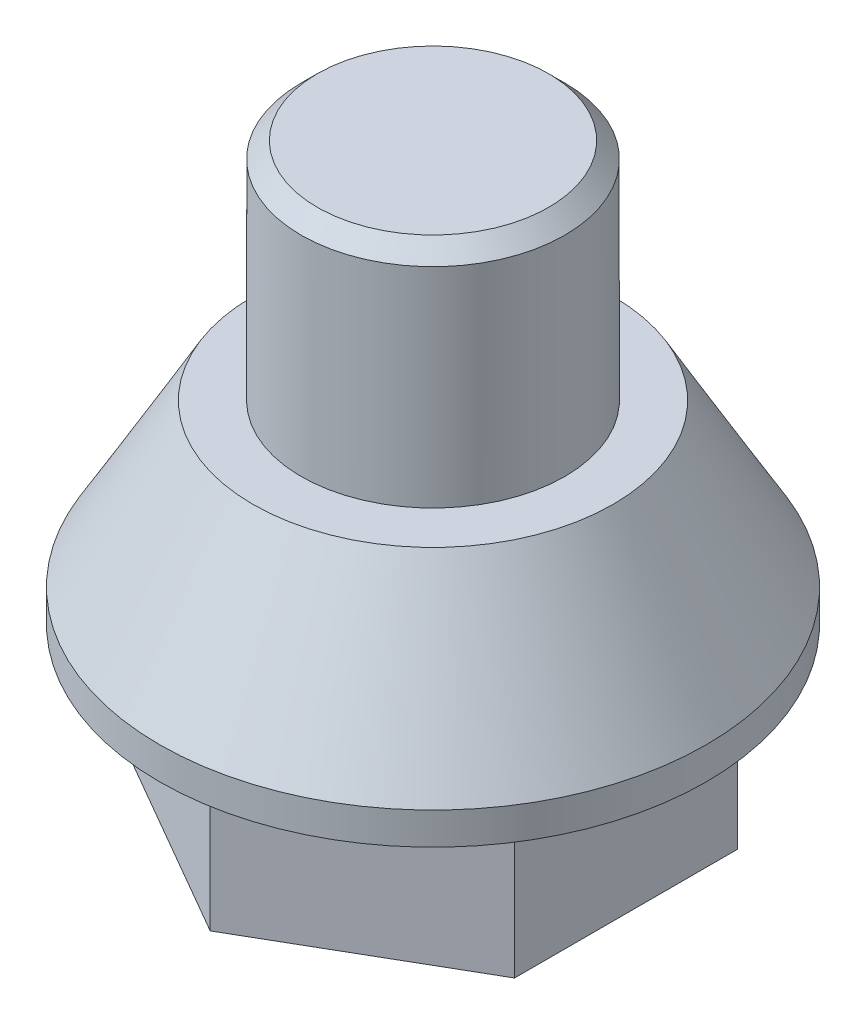
ISO-10303-21;
HEADER;
FILE_DESCRIPTION(('STEP AP214'),'2;1');
FILE_NAME('part.step','',(''),(''),'','','');
FILE_SCHEMA(('AUTOMOTIVE_DESIGN { 1 0 10303 214 1 1 1 1 }'));
ENDSEC;
DATA;
#1=APPLICATION_CONTEXT('core data for automotive mechanical design processes');
#2=APPLICATION_PROTOCOL_DEFINITION('international standard','automotive_design',2000,#1);
#3=PRODUCT_CONTEXT('',#1,'mechanical');
#4=PRODUCT('Part','Part','',(#3));
#5=PRODUCT_RELATED_PRODUCT_CATEGORY('part','',(#4));
#6=PRODUCT_DEFINITION_FORMATION('','',#4);
#7=PRODUCT_DEFINITION_CONTEXT('part definition',#1,'design');
#8=PRODUCT_DEFINITION('design','',#6,#7);
#9=PRODUCT_DEFINITION_SHAPE('','',#8);
#10=(LENGTH_UNIT() NAMED_UNIT(*) SI_UNIT(.MILLI.,.METRE.));
#11=(NAMED_UNIT(*) PLANE_ANGLE_UNIT() SI_UNIT($,.RADIAN.));
#12=(NAMED_UNIT(*) SI_UNIT($,.STERADIAN.) SOLID_ANGLE_UNIT());
#13=UNCERTAINTY_MEASURE_WITH_UNIT(LENGTH_MEASURE(1.E-05),#10,'distance_accuracy_value','');
#14=(GEOMETRIC_REPRESENTATION_CONTEXT(3) GLOBAL_UNCERTAINTY_ASSIGNED_CONTEXT((#13)) GLOBAL_UNIT_ASSIGNED_CONTEXT((#10,
#11,#12)) REPRESENTATION_CONTEXT('',''));
#15=CARTESIAN_POINT('',(0.,0.,0.));
#16=DIRECTION('',(0.,0.,1.));
#17=DIRECTION('',(1.,0.,0.));
#18=AXIS2_PLACEMENT_3D('',#15,#16,#17);
#19=CARTESIAN_POINT('',(-6.00000000000002,4.8,-3.46410161513769));
#20=DIRECTION('',(0.500000000000005,0.,0.866025403784436));
#21=DIRECTION('',(0.866025403784436,0.,-0.500000000000005));
#22=AXIS2_PLACEMENT_3D('',#19,#20,#21);
#23=PLANE('',#22);
#24=DIRECTION('',(-0.866025403784436,0.,0.500000000000005));
#25=VECTOR('',#24,1.);
#26=CARTESIAN_POINT('',(-6.00000000000002,0.,-3.46410161513769));
#27=LINE('',#26,#25);
#28=CARTESIAN_POINT('',(0.,0.,-6.9282032302755));
#29=VERTEX_POINT('',#28);
#30=CARTESIAN_POINT('',(-6.00000000000002,0.,-3.46410161513769));
#31=VERTEX_POINT('',#30);
#32=EDGE_CURVE('E138',#29,#31,#27,.T.);
#33=ORIENTED_EDGE('',*,*,#32,.T.);
#34=DIRECTION('',(0.,-1.,0.));
#35=VECTOR('',#34,1.);
#36=CARTESIAN_POINT('',(-6.00000000000002,4.8,-3.46410161513769));
#37=LINE('',#36,#35);
#38=CARTESIAN_POINT('',(-6.00000000000002,4.8,-3.46410161513769));
#39=VERTEX_POINT('',#38);
#40=EDGE_CURVE('E153',#39,#31,#37,.T.);
#41=ORIENTED_EDGE('',*,*,#40,.F.);
#42=DIRECTION('',(-0.866025403784436,0.,0.500000000000005));
#43=VECTOR('',#42,1.);
#44=CARTESIAN_POINT('',(-6.00000000000002,4.8,-3.46410161513769));
#45=LINE('',#44,#43);
#46=CARTESIAN_POINT('',(0.,4.8,-6.9282032302755));
#47=VERTEX_POINT('',#46);
#48=EDGE_CURVE('E130',#47,#39,#45,.T.);
#49=ORIENTED_EDGE('',*,*,#48,.F.);
#50=DIRECTION('',(0.,-1.,0.));
#51=VECTOR('',#50,1.);
#52=CARTESIAN_POINT('',(0.,4.8,-6.9282032302755));
#53=LINE('',#52,#51);
#54=EDGE_CURVE('E137',#47,#29,#53,.T.);
#55=ORIENTED_EDGE('',*,*,#54,.T.);
#56=EDGE_LOOP('',(#33,#41,#49,#55));
#57=FACE_BOUND('',#56,.T.);
#58=ADVANCED_FACE('F43',(#57),#23,.F.);
#59=CARTESIAN_POINT('',(-5.99999999999997,4.8,3.46410161513778));
#60=DIRECTION('',(1.,0.,0.));
#61=DIRECTION('',(0.,0.,-1.));
#62=AXIS2_PLACEMENT_3D('',#59,#60,#61);
#63=PLANE('',#62);
#64=DIRECTION('',(0.,0.,1.));
#65=VECTOR('',#64,1.);
#66=CARTESIAN_POINT('',(-5.99999999999997,0.,3.46410161513778));
#67=LINE('',#66,#65);
#68=CARTESIAN_POINT('',(-5.99999999999997,0.,3.46410161513778));
#69=VERTEX_POINT('',#68);
#70=EDGE_CURVE('E141',#31,#69,#67,.T.);
#71=ORIENTED_EDGE('',*,*,#70,.T.);
#72=DIRECTION('',(0.,-1.,0.));
#73=VECTOR('',#72,1.);
#74=CARTESIAN_POINT('',(-5.99999999999997,4.8,3.46410161513778));
#75=LINE('',#74,#73);
#76=CARTESIAN_POINT('',(-5.99999999999997,4.8,3.46410161513778));
#77=VERTEX_POINT('',#76);
#78=EDGE_CURVE('E116',#77,#69,#75,.T.);
#79=ORIENTED_EDGE('',*,*,#78,.F.);
#80=DIRECTION('',(0.,0.,1.));
#81=VECTOR('',#80,1.);
#82=CARTESIAN_POINT('',(-5.99999999999997,4.8,3.46410161513778));
#83=LINE('',#82,#81);
#84=EDGE_CURVE('E98',#39,#77,#83,.T.);
#85=ORIENTED_EDGE('',*,*,#84,.F.);
#86=ORIENTED_EDGE('',*,*,#40,.T.);
#87=EDGE_LOOP('',(#71,#79,#85,#86));
#88=FACE_BOUND('',#87,.T.);
#89=ADVANCED_FACE('F170',(#88),#63,.F.);
#90=CARTESIAN_POINT('',(0.,4.8,6.9282032302755));
#91=DIRECTION('',(0.499999999999997,0.,-0.86602540378444));
#92=DIRECTION('',(-0.86602540378444,0.,-0.499999999999997));
#93=AXIS2_PLACEMENT_3D('',#90,#91,#92);
#94=PLANE('',#93);
#95=DIRECTION('',(0.86602540378444,0.,0.499999999999997));
#96=VECTOR('',#95,1.);
#97=CARTESIAN_POINT('',(0.,0.,6.9282032302755));
#98=LINE('',#97,#96);
#99=CARTESIAN_POINT('',(0.,0.,6.9282032302755));
#100=VERTEX_POINT('',#99);
#101=EDGE_CURVE('E113',#69,#100,#98,.T.);
#102=ORIENTED_EDGE('',*,*,#101,.T.);
#103=DIRECTION('',(0.,-1.,0.));
#104=VECTOR('',#103,1.);
#105=CARTESIAN_POINT('',(0.,4.8,6.9282032302755));
#106=LINE('',#105,#104);
#107=CARTESIAN_POINT('',(0.,4.8,6.9282032302755));
#108=VERTEX_POINT('',#107);
#109=EDGE_CURVE('E106',#108,#100,#106,.T.);
#110=ORIENTED_EDGE('',*,*,#109,.F.);
#111=DIRECTION('',(0.86602540378444,0.,0.499999999999997));
#112=VECTOR('',#111,1.);
#113=CARTESIAN_POINT('',(0.,4.8,6.9282032302755));
#114=LINE('',#113,#112);
#115=EDGE_CURVE('E111',#77,#108,#114,.T.);
#116=ORIENTED_EDGE('',*,*,#115,.F.);
#117=ORIENTED_EDGE('',*,*,#78,.T.);
#118=EDGE_LOOP('',(#102,#110,#116,#117));
#119=FACE_BOUND('',#118,.T.);
#120=ADVANCED_FACE('F108',(#119),#94,.F.);
#121=CARTESIAN_POINT('',(6.00000000000003,4.8,3.46410161513769));
#122=DIRECTION('',(-0.500000000000005,0.,-0.866025403784436));
#123=DIRECTION('',(-0.866025403784436,0.,0.500000000000005));
#124=AXIS2_PLACEMENT_3D('',#121,#122,#123);
#125=PLANE('',#124);
#126=DIRECTION('',(0.866025403784436,0.,-0.500000000000005));
#127=VECTOR('',#126,1.);
#128=CARTESIAN_POINT('',(6.00000000000003,0.,3.46410161513769));
#129=LINE('',#128,#127);
#130=CARTESIAN_POINT('',(6.00000000000003,0.,3.46410161513769));
#131=VERTEX_POINT('',#130);
#132=EDGE_CURVE('E145',#100,#131,#129,.T.);
#133=ORIENTED_EDGE('',*,*,#132,.T.);
#134=DIRECTION('',(0.,-1.,0.));
#135=VECTOR('',#134,1.);
#136=CARTESIAN_POINT('',(6.00000000000003,4.8,3.46410161513769));
#137=LINE('',#136,#135);
#138=CARTESIAN_POINT('',(6.00000000000003,4.8,3.46410161513769));
#139=VERTEX_POINT('',#138);
#140=EDGE_CURVE('E117',#139,#131,#137,.T.);
#141=ORIENTED_EDGE('',*,*,#140,.F.);
#142=DIRECTION('',(0.866025403784436,0.,-0.500000000000005));
#143=VECTOR('',#142,1.);
#144=CARTESIAN_POINT('',(6.00000000000003,4.8,3.46410161513769));
#145=LINE('',#144,#143);
#146=EDGE_CURVE('E120',#108,#139,#145,.T.);
#147=ORIENTED_EDGE('',*,*,#146,.F.);
#148=ORIENTED_EDGE('',*,*,#109,.T.);
#149=EDGE_LOOP('',(#133,#141,#147,#148));
#150=FACE_BOUND('',#149,.T.);
#151=ADVANCED_FACE('F121',(#150),#125,.F.);
#152=CARTESIAN_POINT('',(5.99999999999997,4.8,-3.46410161513778));
#153=DIRECTION('',(-1.,0.,0.));
#154=DIRECTION('',(0.,0.,1.));
#155=AXIS2_PLACEMENT_3D('',#152,#153,#154);
#156=PLANE('',#155);
#157=DIRECTION('',(0.,0.,-1.));
#158=VECTOR('',#157,1.);
#159=CARTESIAN_POINT('',(5.99999999999997,0.,-3.46410161513778));
#160=LINE('',#159,#158);
#161=CARTESIAN_POINT('',(5.99999999999997,0.,-3.46410161513778));
#162=VERTEX_POINT('',#161);
#163=EDGE_CURVE('E83',#131,#162,#160,.T.);
#164=ORIENTED_EDGE('',*,*,#163,.T.);
#165=DIRECTION('',(0.,-1.,0.));
#166=VECTOR('',#165,1.);
#167=CARTESIAN_POINT('',(5.99999999999997,4.8,-3.46410161513778));
#168=LINE('',#167,#166);
#169=CARTESIAN_POINT('',(5.99999999999997,4.8,-3.46410161513778));
#170=VERTEX_POINT('',#169);
#171=EDGE_CURVE('E61',#170,#162,#168,.T.);
#172=ORIENTED_EDGE('',*,*,#171,.F.);
#173=DIRECTION('',(0.,0.,-1.));
#174=VECTOR('',#173,1.);
#175=CARTESIAN_POINT('',(5.99999999999997,4.8,-3.46410161513778));
#176=LINE('',#175,#174);
#177=EDGE_CURVE('E124',#139,#170,#176,.T.);
#178=ORIENTED_EDGE('',*,*,#177,.F.);
#179=ORIENTED_EDGE('',*,*,#140,.T.);
#180=EDGE_LOOP('',(#164,#172,#178,#179));
#181=FACE_BOUND('',#180,.T.);
#182=ADVANCED_FACE('F181',(#181),#156,.F.);
#183=CARTESIAN_POINT('',(0.,4.8,-6.9282032302755));
#184=DIRECTION('',(-0.499999999999997,0.,0.86602540378444));
#185=DIRECTION('',(0.86602540378444,0.,0.499999999999997));
#186=AXIS2_PLACEMENT_3D('',#183,#184,#185);
#187=PLANE('',#186);
#188=DIRECTION('',(-0.86602540378444,0.,-0.499999999999997));
#189=VECTOR('',#188,1.);
#190=CARTESIAN_POINT('',(0.,0.,-6.9282032302755));
#191=LINE('',#190,#189);
#192=EDGE_CURVE('E89',#162,#29,#191,.T.);
#193=ORIENTED_EDGE('',*,*,#192,.T.);
#194=ORIENTED_EDGE('',*,*,#54,.F.);
#195=DIRECTION('',(-0.86602540378444,0.,-0.499999999999997));
#196=VECTOR('',#195,1.);
#197=CARTESIAN_POINT('',(0.,4.8,-6.9282032302755));
#198=LINE('',#197,#196);
#199=EDGE_CURVE('E135',#170,#47,#198,.T.);
#200=ORIENTED_EDGE('',*,*,#199,.F.);
#201=ORIENTED_EDGE('',*,*,#171,.T.);
#202=EDGE_LOOP('',(#193,#194,#200,#201));
#203=FACE_BOUND('',#202,.T.);
#204=ADVANCED_FACE('F184',(#203),#187,.F.);
#205=CARTESIAN_POINT('',(0.,0.,0.));
#206=DIRECTION('',(0.,-1.,0.));
#207=DIRECTION('',(0.,0.,-1.));
#208=AXIS2_PLACEMENT_3D('',#205,#206,#207);
#209=PLANE('',#208);
#210=ORIENTED_EDGE('',*,*,#32,.F.);
#211=ORIENTED_EDGE('',*,*,#192,.F.);
#212=ORIENTED_EDGE('',*,*,#163,.F.);
#213=ORIENTED_EDGE('',*,*,#132,.F.);
#214=ORIENTED_EDGE('',*,*,#101,.F.);
#215=ORIENTED_EDGE('',*,*,#70,.F.);
#216=EDGE_LOOP('',(#210,#211,#212,#213,#214,#215));
#217=FACE_BOUND('',#216,.T.);
#218=ADVANCED_FACE('F187',(#217),#209,.T.);
#219=CARTESIAN_POINT('',(0.,4.8,0.));
#220=DIRECTION('',(0.,1.,0.));
#221=DIRECTION('',(0.,0.,1.));
#222=AXIS2_PLACEMENT_3D('',#219,#220,#221);
#223=PLANE('',#222);
#224=CARTESIAN_POINT('',(0.,4.8,0.));
#225=DIRECTION('',(0.,1.,0.));
#226=DIRECTION('',(0.,0.,1.));
#227=AXIS2_PLACEMENT_3D('',#224,#225,#226);
#228=CIRCLE('',#227,8.5);
#229=CARTESIAN_POINT('',(0.,4.8,8.5));
#230=VERTEX_POINT('',#229);
#231=EDGE_CURVE('E322',#230,#230,#228,.T.);
#232=ORIENTED_EDGE('',*,*,#231,.F.);
#233=EDGE_LOOP('',(#232));
#234=FACE_BOUND('',#233,.T.);
#235=ORIENTED_EDGE('',*,*,#199,.T.);
#236=ORIENTED_EDGE('',*,*,#48,.T.);
#237=ORIENTED_EDGE('',*,*,#84,.T.);
#238=ORIENTED_EDGE('',*,*,#115,.T.);
#239=ORIENTED_EDGE('',*,*,#146,.T.);
#240=ORIENTED_EDGE('',*,*,#177,.T.);
#241=EDGE_LOOP('',(#235,#236,#237,#238,#239,#240));
#242=FACE_BOUND('',#241,.T.);
#243=ADVANCED_FACE('F127',(#234,#242),#223,.F.);
#244=CARTESIAN_POINT('',(0.,5.8,0.));
#245=DIRECTION('',(0.,-1.,0.));
#246=DIRECTION('',(0.,0.,-1.));
#247=AXIS2_PLACEMENT_3D('',#244,#245,#246);
#248=CYLINDRICAL_SURFACE('',#247,8.5);
#249=CARTESIAN_POINT('',(0.,5.8,0.));
#250=DIRECTION('',(0.,1.,0.));
#251=DIRECTION('',(0.,0.,1.));
#252=AXIS2_PLACEMENT_3D('',#249,#250,#251);
#253=CIRCLE('',#252,8.5);
#254=CARTESIAN_POINT('',(0.,5.8,8.5));
#255=VERTEX_POINT('',#254);
#256=EDGE_CURVE('E142',#255,#255,#253,.T.);
#257=ORIENTED_EDGE('',*,*,#256,.F.);
#258=EDGE_LOOP('',(#257));
#259=FACE_BOUND('',#258,.T.);
#260=ORIENTED_EDGE('',*,*,#231,.T.);
#261=EDGE_LOOP('',(#260));
#262=FACE_BOUND('',#261,.T.);
#263=ADVANCED_FACE('F191',(#259,#262),#248,.T.);
#264=CARTESIAN_POINT('',(0.,5.8,0.));
#265=DIRECTION('',(0.,-1.,0.));
#266=DIRECTION('',(1.,0.,0.));
#267=AXIS2_PLACEMENT_3D('',#264,#265,#266);
#268=CONICAL_SURFACE('',#267,8.5,0.523598775598304);
#269=CARTESIAN_POINT('',(0.,10.8229473419497,0.));
#270=DIRECTION('',(0.,-1.,0.));
#271=DIRECTION('',(1.,0.,0.));
#272=AXIS2_PLACEMENT_3D('',#269,#270,#271);
#273=CIRCLE('',#272,5.6);
#274=CARTESIAN_POINT('',(5.6,10.8229473419497,0.));
#275=VERTEX_POINT('',#274);
#276=EDGE_CURVE('E321',#275,#275,#273,.T.);
#277=ORIENTED_EDGE('',*,*,#276,.T.);
#278=EDGE_LOOP('',(#277));
#279=FACE_BOUND('',#278,.T.);
#280=ORIENTED_EDGE('',*,*,#256,.T.);
#281=EDGE_LOOP('',(#280));
#282=FACE_BOUND('',#281,.T.);
#283=ADVANCED_FACE('F194',(#279,#282),#268,.T.);
#284=CARTESIAN_POINT('',(5.6,10.8229473419497,0.));
#285=DIRECTION('',(0.,1.,0.));
#286=DIRECTION('',(-1.,0.,0.));
#287=AXIS2_PLACEMENT_3D('',#284,#285,#286);
#288=PLANE('',#287);
#289=CARTESIAN_POINT('',(0.,10.8229473419497,0.));
#290=DIRECTION('',(0.,-1.,0.));
#291=DIRECTION('',(1.,0.,0.));
#292=AXIS2_PLACEMENT_3D('',#289,#290,#291);
#293=CIRCLE('',#292,4.1);
#294=CARTESIAN_POINT('',(4.1,10.8229473419497,0.));
#295=VERTEX_POINT('',#294);
#296=EDGE_CURVE('E318',#295,#295,#293,.T.);
#297=ORIENTED_EDGE('',*,*,#296,.T.);
#298=EDGE_LOOP('',(#297));
#299=FACE_BOUND('',#298,.T.);
#300=ORIENTED_EDGE('',*,*,#276,.F.);
#301=EDGE_LOOP('',(#300));
#302=FACE_BOUND('',#301,.T.);
#303=ADVANCED_FACE('F201',(#299,#302),#288,.T.);
#304=CARTESIAN_POINT('',(0.,5.8,0.));
#305=DIRECTION('',(0.,-1.,0.));
#306=DIRECTION('',(1.,0.,0.));
#307=AXIS2_PLACEMENT_3D('',#304,#305,#306);
#308=CYLINDRICAL_SURFACE('',#307,4.1);
#309=CARTESIAN_POINT('',(0.,17.3229473419497,0.));
#310=DIRECTION('',(0.,1.,0.));
#311=DIRECTION('',(-1.,0.,0.));
#312=AXIS2_PLACEMENT_3D('',#309,#310,#311);
#313=CIRCLE('',#312,4.1);
#314=CARTESIAN_POINT('',(-4.1,17.3229473419497,0.));
#315=VERTEX_POINT('',#314);
#316=EDGE_CURVE('E53',#315,#315,#313,.F.);
#317=ORIENTED_EDGE('',*,*,#316,.T.);
#318=EDGE_LOOP('',(#317));
#319=FACE_BOUND('',#318,.T.);
#320=ORIENTED_EDGE('',*,*,#296,.F.);
#321=EDGE_LOOP('',(#320));
#322=FACE_BOUND('',#321,.T.);
#323=ADVANCED_FACE('F157',(#319,#322),#308,.T.);
#324=CARTESIAN_POINT('',(4.1,17.8229473419497,0.));
#325=DIRECTION('',(0.,1.,0.));
#326=DIRECTION('',(-1.,0.,0.));
#327=AXIS2_PLACEMENT_3D('',#324,#325,#326);
#328=PLANE('',#327);
#329=CARTESIAN_POINT('',(0.,17.8229473419497,0.));
#330=DIRECTION('',(0.,1.,0.));
#331=DIRECTION('',(-1.,0.,0.));
#332=AXIS2_PLACEMENT_3D('',#329,#330,#331);
#333=CIRCLE('',#332,3.59999999999999);
#334=CARTESIAN_POINT('',(-3.59999999999999,17.8229473419497,0.));
#335=VERTEX_POINT('',#334);
#336=EDGE_CURVE('E11',#335,#335,#333,.T.);
#337=ORIENTED_EDGE('',*,*,#336,.T.);
#338=EDGE_LOOP('',(#337));
#339=FACE_BOUND('',#338,.T.);
#340=ADVANCED_FACE('F161',(#339),#328,.T.);
#341=CARTESIAN_POINT('',(0.,17.3229473419497,0.));
#342=DIRECTION('',(0.,-1.,0.));
#343=DIRECTION('',(1.,0.,0.));
#344=AXIS2_PLACEMENT_3D('',#341,#342,#343);
#345=CONICAL_SURFACE('',#344,4.1,0.785398163397452);
#346=ORIENTED_EDGE('',*,*,#336,.F.);
#347=EDGE_LOOP('',(#346));
#348=FACE_BOUND('',#347,.T.);
#349=ORIENTED_EDGE('',*,*,#316,.F.);
#350=EDGE_LOOP('',(#349));
#351=FACE_BOUND('',#350,.T.);
#352=ADVANCED_FACE('F46',(#348,#351),#345,.T.);
#353=CLOSED_SHELL('',(#58,#89,#120,#151,#182,#204,#218,#243,#263,#283,#303,#323,#340,#352));
#354=MANIFOLD_SOLID_BREP('B2',#353);
#355=ADVANCED_BREP_SHAPE_REPRESENTATION('',(#18,#354),#14);
#356=SHAPE_DEFINITION_REPRESENTATION(#9,#355);
ENDSEC;
END-ISO-10303-21;
